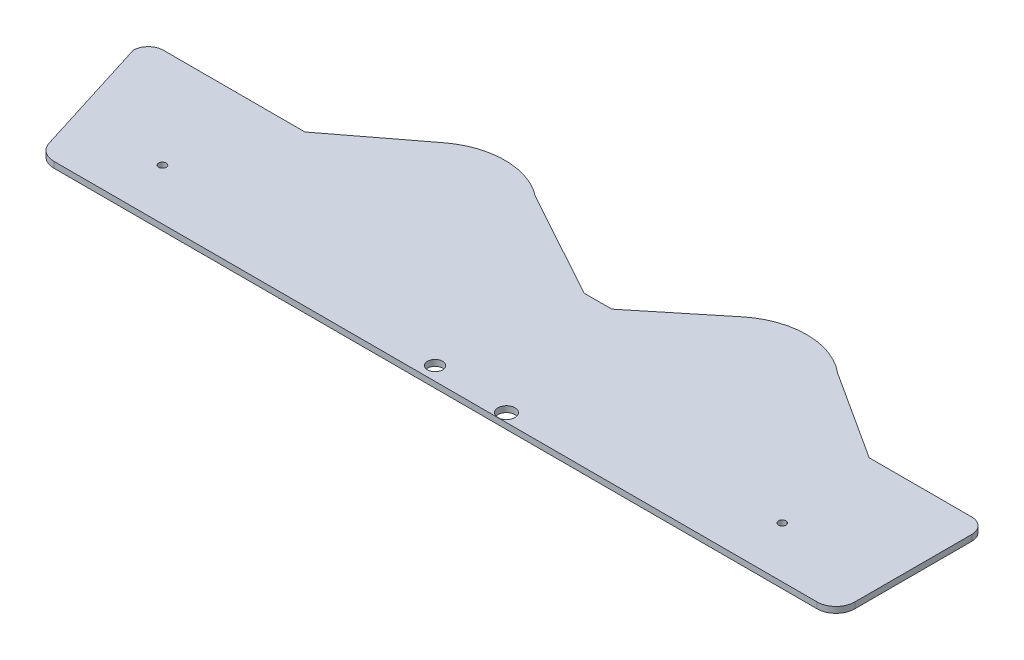
ISO-10303-21;
HEADER;
FILE_DESCRIPTION(('STEP AP214'),'2;1');
FILE_NAME('part.step','',(''),(''),'','','');
FILE_SCHEMA(('AUTOMOTIVE_DESIGN { 1 0 10303 214 1 1 1 1 }'));
ENDSEC;
DATA;
#1=APPLICATION_CONTEXT('core data for automotive mechanical design processes');
#2=APPLICATION_PROTOCOL_DEFINITION('international standard','automotive_design',2000,#1);
#3=PRODUCT_CONTEXT('',#1,'mechanical');
#4=PRODUCT('Part','Part','',(#3));
#5=PRODUCT_RELATED_PRODUCT_CATEGORY('part','',(#4));
#6=PRODUCT_DEFINITION_FORMATION('','',#4);
#7=PRODUCT_DEFINITION_CONTEXT('part definition',#1,'design');
#8=PRODUCT_DEFINITION('design','',#6,#7);
#9=PRODUCT_DEFINITION_SHAPE('','',#8);
#10=(LENGTH_UNIT() NAMED_UNIT(*) SI_UNIT(.MILLI.,.METRE.));
#11=(NAMED_UNIT(*) PLANE_ANGLE_UNIT() SI_UNIT($,.RADIAN.));
#12=(NAMED_UNIT(*) SI_UNIT($,.STERADIAN.) SOLID_ANGLE_UNIT());
#13=UNCERTAINTY_MEASURE_WITH_UNIT(LENGTH_MEASURE(1.E-05),#10,'distance_accuracy_value','');
#14=(GEOMETRIC_REPRESENTATION_CONTEXT(3) GLOBAL_UNCERTAINTY_ASSIGNED_CONTEXT((#13)) GLOBAL_UNIT_ASSIGNED_CONTEXT((#10,
#11,#12)) REPRESENTATION_CONTEXT('',''));
#15=CARTESIAN_POINT('',(0.,0.,0.));
#16=DIRECTION('',(0.,0.,1.));
#17=DIRECTION('',(1.,0.,0.));
#18=AXIS2_PLACEMENT_3D('',#15,#16,#17);
#19=CARTESIAN_POINT('',(0.,3.175,-150.));
#20=DIRECTION('',(0.,0.,-1.));
#21=DIRECTION('',(-1.,0.,0.));
#22=AXIS2_PLACEMENT_3D('',#19,#20,#21);
#23=PLANE('',#22);
#24=DIRECTION('',(1.,0.,0.));
#25=VECTOR('',#24,1.);
#26=CARTESIAN_POINT('',(0.,0.,-150.));
#27=LINE('',#26,#25);
#28=CARTESIAN_POINT('',(382.106475607173,0.,-150.));
#29=VERTEX_POINT('',#28);
#30=CARTESIAN_POINT('',(436.5,0.,-150.));
#31=VERTEX_POINT('',#30);
#32=EDGE_CURVE('E59',#29,#31,#27,.T.);
#33=ORIENTED_EDGE('',*,*,#32,.F.);
#34=DIRECTION('',(0.,-1.,0.));
#35=VECTOR('',#34,1.);
#36=CARTESIAN_POINT('',(382.106475607173,3.175,-150.));
#37=LINE('',#36,#35);
#38=CARTESIAN_POINT('',(382.106475607173,3.175,-150.));
#39=VERTEX_POINT('',#38);
#40=EDGE_CURVE('E54',#39,#29,#37,.T.);
#41=ORIENTED_EDGE('',*,*,#40,.F.);
#42=DIRECTION('',(1.,0.,0.));
#43=VECTOR('',#42,1.);
#44=CARTESIAN_POINT('',(0.,3.175,-150.));
#45=LINE('',#44,#43);
#46=CARTESIAN_POINT('',(436.5,3.175,-150.));
#47=VERTEX_POINT('',#46);
#48=EDGE_CURVE('E236',#39,#47,#45,.T.);
#49=ORIENTED_EDGE('',*,*,#48,.T.);
#50=DIRECTION('',(0.,-1.,0.));
#51=VECTOR('',#50,1.);
#52=CARTESIAN_POINT('',(436.5,3.175,-150.));
#53=LINE('',#52,#51);
#54=EDGE_CURVE('E265',#47,#31,#53,.T.);
#55=ORIENTED_EDGE('',*,*,#54,.T.);
#56=EDGE_LOOP('',(#33,#41,#49,#55));
#57=FACE_BOUND('',#56,.T.);
#58=ADVANCED_FACE('F39',(#57),#23,.T.);
#59=CARTESIAN_POINT('',(309.,3.175,-150.));
#60=DIRECTION('',(0.,-1.,0.));
#61=DIRECTION('',(0.,0.,-1.));
#62=AXIS2_PLACEMENT_3D('',#59,#60,#61);
#63=CYLINDRICAL_SURFACE('',#62,40.);
#64=DIRECTION('',(0.,-1.,0.));
#65=VECTOR('',#64,1.);
#66=CARTESIAN_POINT('',(283.734164599155,3.175,-181.010281544955));
#67=LINE('',#66,#65);
#68=CARTESIAN_POINT('',(283.734164599155,3.175,-181.010281544955));
#69=VERTEX_POINT('',#68);
#70=CARTESIAN_POINT('',(283.734164599155,0.,-181.010281544955));
#71=VERTEX_POINT('',#70);
#72=EDGE_CURVE('E180',#69,#71,#67,.T.);
#73=ORIENTED_EDGE('',*,*,#72,.F.);
#74=CARTESIAN_POINT('',(309.,3.175,-150.));
#75=DIRECTION('',(0.,1.,0.));
#76=DIRECTION('',(0.,0.,1.));
#77=AXIS2_PLACEMENT_3D('',#74,#75,#76);
#78=CIRCLE('',#77,40.);
#79=CARTESIAN_POINT('',(334.871034878903,3.175,-180.507204957101));
#80=VERTEX_POINT('',#79);
#81=EDGE_CURVE('E163',#80,#69,#78,.T.);
#82=ORIENTED_EDGE('',*,*,#81,.F.);
#83=DIRECTION('',(0.,-1.,0.));
#84=VECTOR('',#83,1.);
#85=CARTESIAN_POINT('',(334.871034878903,3.175,-180.507204957101));
#86=LINE('',#85,#84);
#87=CARTESIAN_POINT('',(334.871034878903,0.,-180.507204957101));
#88=VERTEX_POINT('',#87);
#89=EDGE_CURVE('E11',#88,#80,#86,.F.);
#90=ORIENTED_EDGE('',*,*,#89,.F.);
#91=CARTESIAN_POINT('',(309.,0.,-150.));
#92=DIRECTION('',(0.,1.,0.));
#93=DIRECTION('',(0.,0.,1.));
#94=AXIS2_PLACEMENT_3D('',#91,#92,#93);
#95=CIRCLE('',#94,40.);
#96=EDGE_CURVE('E150',#88,#71,#95,.T.);
#97=ORIENTED_EDGE('',*,*,#96,.T.);
#98=EDGE_LOOP('',(#73,#82,#90,#97));
#99=FACE_BOUND('',#98,.T.);
#100=ADVANCED_FACE('F162',(#99),#63,.T.);
#101=CARTESIAN_POINT('',(231.01461959859,3.175,-150.));
#102=VERTEX_POINT('',#101);
#103=CARTESIAN_POINT('',(245.673378314399,3.175,-150.));
#104=VERTEX_POINT('',#103);
#105=EDGE_CURVE('E240',#102,#104,#45,.T.);
#106=ORIENTED_EDGE('',*,*,#105,.T.);
#107=DIRECTION('',(0.,-1.,0.));
#108=VECTOR('',#107,1.);
#109=CARTESIAN_POINT('',(245.673378314399,3.175,-150.));
#110=LINE('',#109,#108);
#111=CARTESIAN_POINT('',(245.673378314399,0.,-150.));
#112=VERTEX_POINT('',#111);
#113=EDGE_CURVE('E175',#104,#112,#110,.T.);
#114=ORIENTED_EDGE('',*,*,#113,.T.);
#115=CARTESIAN_POINT('',(231.01461959859,0.,-150.));
#116=VERTEX_POINT('',#115);
#117=EDGE_CURVE('E257',#116,#112,#27,.T.);
#118=ORIENTED_EDGE('',*,*,#117,.F.);
#119=DIRECTION('',(0.,1.,0.));
#120=VECTOR('',#119,1.);
#121=CARTESIAN_POINT('',(231.01461959859,3.175,-150.));
#122=LINE('',#121,#120);
#123=EDGE_CURVE('E200',#116,#102,#122,.T.);
#124=ORIENTED_EDGE('',*,*,#123,.T.);
#125=EDGE_LOOP('',(#106,#114,#118,#124));
#126=FACE_BOUND('',#125,.T.);
#127=ADVANCED_FACE('F314',(#126),#23,.T.);
#128=CARTESIAN_POINT('',(8.,3.175,-150.));
#129=VERTEX_POINT('',#128);
#130=CARTESIAN_POINT('',(83.029725003325,3.175,-150.));
#131=VERTEX_POINT('',#130);
#132=EDGE_CURVE('E237',#129,#131,#45,.T.);
#133=ORIENTED_EDGE('',*,*,#132,.T.);
#134=DIRECTION('',(0.,-1.,0.));
#135=VECTOR('',#134,1.);
#136=CARTESIAN_POINT('',(83.0297250033249,3.175,-150.));
#137=LINE('',#136,#135);
#138=CARTESIAN_POINT('',(83.029725003325,0.,-150.));
#139=VERTEX_POINT('',#138);
#140=EDGE_CURVE('E202',#131,#139,#137,.T.);
#141=ORIENTED_EDGE('',*,*,#140,.T.);
#142=CARTESIAN_POINT('',(8.,0.,-150.));
#143=VERTEX_POINT('',#142);
#144=EDGE_CURVE('E253',#143,#139,#27,.T.);
#145=ORIENTED_EDGE('',*,*,#144,.F.);
#146=DIRECTION('',(0.,-1.,0.));
#147=VECTOR('',#146,1.);
#148=CARTESIAN_POINT('',(8.,3.175,-150.));
#149=LINE('',#148,#147);
#150=EDGE_CURVE('E263',#129,#143,#149,.T.);
#151=ORIENTED_EDGE('',*,*,#150,.F.);
#152=EDGE_LOOP('',(#133,#141,#145,#151));
#153=FACE_BOUND('',#152,.T.);
#154=ADVANCED_FACE('F315',(#153),#23,.T.);
#155=CARTESIAN_POINT('',(149.,3.175,-150.040398610273));
#156=DIRECTION('',(0.,-1.,0.));
#157=DIRECTION('',(0.,0.,-1.));
#158=AXIS2_PLACEMENT_3D('',#155,#156,#157);
#159=CYLINDRICAL_SURFACE('',#158,40.);
#160=DIRECTION('',(0.,-1.,0.));
#161=VECTOR('',#160,1.);
#162=CARTESIAN_POINT('',(124.164543782823,3.175,-181.39642059146));
#163=LINE('',#162,#161);
#164=CARTESIAN_POINT('',(124.164543782823,3.175,-181.39642059146));
#165=VERTEX_POINT('',#164);
#166=CARTESIAN_POINT('',(124.164543782823,0.,-181.39642059146));
#167=VERTEX_POINT('',#166);
#168=EDGE_CURVE('E197',#165,#167,#163,.T.);
#169=ORIENTED_EDGE('',*,*,#168,.F.);
#170=CARTESIAN_POINT('',(149.,3.175,-150.040398610273));
#171=DIRECTION('',(0.,1.,0.));
#172=DIRECTION('',(0.,0.,1.));
#173=AXIS2_PLACEMENT_3D('',#170,#171,#172);
#174=CIRCLE('',#173,40.);
#175=CARTESIAN_POINT('',(173.835456217177,3.175,-181.39642059146));
#176=VERTEX_POINT('',#175);
#177=EDGE_CURVE('E205',#176,#165,#174,.T.);
#178=ORIENTED_EDGE('',*,*,#177,.F.);
#179=DIRECTION('',(0.,-1.,0.));
#180=VECTOR('',#179,1.);
#181=CARTESIAN_POINT('',(173.835456217177,3.175,-181.39642059146));
#182=LINE('',#181,#180);
#183=CARTESIAN_POINT('',(173.835456217177,0.,-181.39642059146));
#184=VERTEX_POINT('',#183);
#185=EDGE_CURVE('E190',#176,#184,#182,.T.);
#186=ORIENTED_EDGE('',*,*,#185,.T.);
#187=CARTESIAN_POINT('',(149.,0.,-150.040398610273));
#188=DIRECTION('',(0.,1.,0.));
#189=DIRECTION('',(0.,0.,1.));
#190=AXIS2_PLACEMENT_3D('',#187,#188,#189);
#191=CIRCLE('',#190,40.);
#192=EDGE_CURVE('E204',#184,#167,#191,.T.);
#193=ORIENTED_EDGE('',*,*,#192,.T.);
#194=EDGE_LOOP('',(#169,#178,#186,#193));
#195=FACE_BOUND('',#194,.T.);
#196=ADVANCED_FACE('F325',(#195),#159,.T.);
#197=CARTESIAN_POINT('',(444.5,3.175,0.));
#198=DIRECTION('',(-1.,0.,0.));
#199=DIRECTION('',(0.,0.,1.));
#200=AXIS2_PLACEMENT_3D('',#197,#198,#199);
#201=PLANE('',#200);
#202=DIRECTION('',(0.,0.,-1.));
#203=VECTOR('',#202,1.);
#204=CARTESIAN_POINT('',(444.5,3.175,0.));
#205=LINE('',#204,#203);
#206=CARTESIAN_POINT('',(444.5,3.175,-80.));
#207=VERTEX_POINT('',#206);
#208=CARTESIAN_POINT('',(444.5,3.175,-142.));
#209=VERTEX_POINT('',#208);
#210=EDGE_CURVE('E230',#207,#209,#205,.T.);
#211=ORIENTED_EDGE('',*,*,#210,.F.);
#212=DIRECTION('',(0.,1.,0.));
#213=VECTOR('',#212,1.);
#214=CARTESIAN_POINT('',(444.5,0.,-80.));
#215=LINE('',#214,#213);
#216=CARTESIAN_POINT('',(444.5,0.,-80.));
#217=VERTEX_POINT('',#216);
#218=EDGE_CURVE('E287',#207,#217,#215,.F.);
#219=ORIENTED_EDGE('',*,*,#218,.T.);
#220=DIRECTION('',(0.,0.,-1.));
#221=VECTOR('',#220,1.);
#222=CARTESIAN_POINT('',(444.5,0.,0.));
#223=LINE('',#222,#221);
#224=CARTESIAN_POINT('',(444.5,0.,-142.));
#225=VERTEX_POINT('',#224);
#226=EDGE_CURVE('E248',#217,#225,#223,.T.);
#227=ORIENTED_EDGE('',*,*,#226,.T.);
#228=DIRECTION('',(0.,-1.,0.));
#229=VECTOR('',#228,1.);
#230=CARTESIAN_POINT('',(444.5,3.175,-142.));
#231=LINE('',#230,#229);
#232=EDGE_CURVE('E267',#209,#225,#231,.T.);
#233=ORIENTED_EDGE('',*,*,#232,.F.);
#234=EDGE_LOOP('',(#211,#219,#227,#233));
#235=FACE_BOUND('',#234,.T.);
#236=ADVANCED_FACE('F330',(#235),#201,.F.);
#237=CARTESIAN_POINT('',(40.5261663286004,3.175,-12.7022312373225));
#238=DIRECTION('',(0.954226213925607,0.,-0.29908582824534));
#239=DIRECTION('',(-0.29908582824534,0.,-0.954226213925608));
#240=AXIS2_PLACEMENT_3D('',#237,#238,#239);
#241=PLANE('',#240);
#242=DIRECTION('',(0.29908582824534,0.,0.954226213925608));
#243=VECTOR('',#242,1.);
#244=CARTESIAN_POINT('',(40.5261663286004,0.,-12.7022312373225));
#245=LINE('',#244,#243);
#246=CARTESIAN_POINT('',(0.,0.,-142.));
#247=VERTEX_POINT('',#246);
#248=CARTESIAN_POINT('',(20.3702690139033,0.,-77.0091417175466));
#249=VERTEX_POINT('',#248);
#250=EDGE_CURVE('E231',#247,#249,#245,.T.);
#251=ORIENTED_EDGE('',*,*,#250,.T.);
#252=DIRECTION('',(0.,-1.,0.));
#253=VECTOR('',#252,1.);
#254=CARTESIAN_POINT('',(20.3702690139033,3.175,-77.0091417175466));
#255=LINE('',#254,#253);
#256=CARTESIAN_POINT('',(20.3702690139033,3.175,-77.0091417175466));
#257=VERTEX_POINT('',#256);
#258=EDGE_CURVE('E278',#249,#257,#255,.F.);
#259=ORIENTED_EDGE('',*,*,#258,.T.);
#260=DIRECTION('',(0.29908582824534,0.,0.954226213925608));
#261=VECTOR('',#260,1.);
#262=CARTESIAN_POINT('',(40.5261663286004,3.175,-12.7022312373225));
#263=LINE('',#262,#261);
#264=CARTESIAN_POINT('',(0.,3.175,-142.));
#265=VERTEX_POINT('',#264);
#266=EDGE_CURVE('E242',#265,#257,#263,.T.);
#267=ORIENTED_EDGE('',*,*,#266,.F.);
#268=DIRECTION('',(0.,-1.,0.));
#269=VECTOR('',#268,1.);
#270=CARTESIAN_POINT('',(0.,3.175,-142.));
#271=LINE('',#270,#269);
#272=EDGE_CURVE('E245',#265,#247,#271,.T.);
#273=ORIENTED_EDGE('',*,*,#272,.T.);
#274=EDGE_LOOP('',(#251,#259,#267,#273));
#275=FACE_BOUND('',#274,.T.);
#276=ADVANCED_FACE('F352',(#275),#241,.F.);
#277=CARTESIAN_POINT('',(0.,3.175,0.));
#278=DIRECTION('',(0.,1.,0.));
#279=DIRECTION('',(0.,0.,1.));
#280=AXIS2_PLACEMENT_3D('',#277,#278,#279);
#281=PLANE('',#280);
#282=ORIENTED_EDGE('',*,*,#81,.T.);
#283=DIRECTION('',(-0.775257038623885,0.,0.631645885021129));
#284=VECTOR('',#283,1.);
#285=CARTESIAN_POINT('',(24.5647227929031,3.175,30.1497638133203));
#286=LINE('',#285,#284);
#287=EDGE_CURVE('E174',#69,#104,#286,.T.);
#288=ORIENTED_EDGE('',*,*,#287,.T.);
#289=ORIENTED_EDGE('',*,*,#105,.F.);
#290=DIRECTION('',(-0.876553077336371,0.,-0.48130520733952));
#291=VECTOR('',#290,1.);
#292=CARTESIAN_POINT('',(173.835456217177,3.175,-181.39642059146));
#293=LINE('',#292,#291);
#294=EDGE_CURVE('E186',#102,#176,#293,.T.);
#295=ORIENTED_EDGE('',*,*,#294,.T.);
#296=ORIENTED_EDGE('',*,*,#177,.T.);
#297=DIRECTION('',(-0.794913416528383,0.,0.606722885857435));
#298=VECTOR('',#297,1.);
#299=CARTESIAN_POINT('',(124.164543782823,3.175,-181.39642059146));
#300=LINE('',#299,#298);
#301=EDGE_CURVE('E183',#165,#131,#300,.T.);
#302=ORIENTED_EDGE('',*,*,#301,.T.);
#303=ORIENTED_EDGE('',*,*,#132,.F.);
#304=CARTESIAN_POINT('',(8.,3.175,-142.));
#305=DIRECTION('',(0.,1.,0.));
#306=DIRECTION('',(0.,0.,1.));
#307=AXIS2_PLACEMENT_3D('',#304,#305,#306);
#308=CIRCLE('',#307,8.);
#309=EDGE_CURVE('E239',#129,#265,#308,.T.);
#310=ORIENTED_EDGE('',*,*,#309,.T.);
#311=ORIENTED_EDGE('',*,*,#266,.T.);
#312=CARTESIAN_POINT('',(29.9125311531594,3.175,-80.));
#313=DIRECTION('',(0.,1.,0.));
#314=DIRECTION('',(0.,0.,1.));
#315=AXIS2_PLACEMENT_3D('',#312,#313,#314);
#316=CIRCLE('',#315,10.);
#317=CARTESIAN_POINT('',(29.9125311531594,3.175,-70.));
#318=VERTEX_POINT('',#317);
#319=EDGE_CURVE('E280',#257,#318,#316,.T.);
#320=ORIENTED_EDGE('',*,*,#319,.T.);
#321=DIRECTION('',(1.,0.,0.));
#322=VECTOR('',#321,1.);
#323=CARTESIAN_POINT('',(0.,3.175,-70.));
#324=LINE('',#323,#322);
#325=CARTESIAN_POINT('',(434.5,3.175,-70.));
#326=VERTEX_POINT('',#325);
#327=EDGE_CURVE('E223',#318,#326,#324,.T.);
#328=ORIENTED_EDGE('',*,*,#327,.T.);
#329=CARTESIAN_POINT('',(434.5,3.175,-80.));
#330=DIRECTION('',(0.,1.,0.));
#331=DIRECTION('',(0.,0.,1.));
#332=AXIS2_PLACEMENT_3D('',#329,#330,#331);
#333=CIRCLE('',#332,10.);
#334=EDGE_CURVE('E285',#326,#207,#333,.T.);
#335=ORIENTED_EDGE('',*,*,#334,.T.);
#336=ORIENTED_EDGE('',*,*,#210,.T.);
#337=CARTESIAN_POINT('',(436.5,3.175,-142.));
#338=DIRECTION('',(0.,1.,0.));
#339=DIRECTION('',(0.,0.,1.));
#340=AXIS2_PLACEMENT_3D('',#337,#338,#339);
#341=CIRCLE('',#340,7.99999999999999);
#342=EDGE_CURVE('E233',#209,#47,#341,.T.);
#343=ORIENTED_EDGE('',*,*,#342,.T.);
#344=ORIENTED_EDGE('',*,*,#48,.F.);
#345=DIRECTION('',(-0.840031412026268,0.,-0.542537765329893));
#346=VECTOR('',#345,1.);
#347=CARTESIAN_POINT('',(326.166341834622,3.175,-186.129166998658));
#348=LINE('',#347,#346);
#349=EDGE_CURVE('E168',#39,#80,#348,.T.);
#350=ORIENTED_EDGE('',*,*,#349,.T.);
#351=EDGE_LOOP('',(#282,#288,#289,#295,#296,#302,#303,#310,#311,#320,#328,#335,#336,#343,#344,#350));
#352=FACE_BOUND('',#351,.T.);
#353=CARTESIAN_POINT('',(265.281257273604,3.175,-74.5638669813257));
#354=DIRECTION('',(0.,1.,0.));
#355=DIRECTION('',(0.,0.,1.));
#356=AXIS2_PLACEMENT_3D('',#353,#354,#355);
#357=CIRCLE('',#356,4.51120579082737);
#358=CARTESIAN_POINT('',(265.281257273604,3.175,-70.0526611904984));
#359=VERTEX_POINT('',#358);
#360=EDGE_CURVE('E227',#359,#359,#357,.T.);
#361=ORIENTED_EDGE('',*,*,#360,.F.);
#362=EDGE_LOOP('',(#361));
#363=FACE_BOUND('',#362,.T.);
#364=CARTESIAN_POINT('',(224.75,3.175,-77.255));
#365=DIRECTION('',(0.,1.,0.));
#366=DIRECTION('',(0.,0.,1.));
#367=AXIS2_PLACEMENT_3D('',#364,#365,#366);
#368=CIRCLE('',#367,3.99083763901675);
#369=CARTESIAN_POINT('',(224.75,3.175,-73.2641623609833));
#370=VERTEX_POINT('',#369);
#371=EDGE_CURVE('E216',#370,#370,#368,.T.);
#372=ORIENTED_EDGE('',*,*,#371,.F.);
#373=EDGE_LOOP('',(#372));
#374=FACE_BOUND('',#373,.T.);
#375=CARTESIAN_POINT('',(60.5,3.175,-97.));
#376=DIRECTION('',(0.,1.,0.));
#377=DIRECTION('',(0.,0.,1.));
#378=AXIS2_PLACEMENT_3D('',#375,#376,#377);
#379=CIRCLE('',#378,2.);
#380=CARTESIAN_POINT('',(60.5,3.175,-95.));
#381=VERTEX_POINT('',#380);
#382=EDGE_CURVE('E217',#381,#381,#379,.T.);
#383=ORIENTED_EDGE('',*,*,#382,.F.);
#384=EDGE_LOOP('',(#383));
#385=FACE_BOUND('',#384,.T.);
#386=CARTESIAN_POINT('',(389.,3.175,-97.));
#387=DIRECTION('',(0.,1.,0.));
#388=DIRECTION('',(0.,0.,1.));
#389=AXIS2_PLACEMENT_3D('',#386,#387,#388);
#390=CIRCLE('',#389,2.);
#391=CARTESIAN_POINT('',(389.,3.175,-95.));
#392=VERTEX_POINT('',#391);
#393=EDGE_CURVE('E208',#392,#392,#390,.T.);
#394=ORIENTED_EDGE('',*,*,#393,.F.);
#395=EDGE_LOOP('',(#394));
#396=FACE_BOUND('',#395,.T.);
#397=ADVANCED_FACE('F339',(#352,#363,#374,#385,#396),#281,.T.);
#398=CARTESIAN_POINT('',(0.,0.,0.));
#399=DIRECTION('',(0.,1.,0.));
#400=DIRECTION('',(0.,0.,1.));
#401=AXIS2_PLACEMENT_3D('',#398,#399,#400);
#402=PLANE('',#401);
#403=DIRECTION('',(-0.775257038623885,0.,0.631645885021129));
#404=VECTOR('',#403,1.);
#405=CARTESIAN_POINT('',(24.5647227929031,0.,30.1497638133203));
#406=LINE('',#405,#404);
#407=EDGE_CURVE('E157',#71,#112,#406,.T.);
#408=ORIENTED_EDGE('',*,*,#407,.F.);
#409=ORIENTED_EDGE('',*,*,#96,.F.);
#410=DIRECTION('',(-0.840031412026268,0.,-0.542537765329893));
#411=VECTOR('',#410,1.);
#412=CARTESIAN_POINT('',(326.166341834622,0.,-186.129166998658));
#413=LINE('',#412,#411);
#414=EDGE_CURVE('E155',#29,#88,#413,.T.);
#415=ORIENTED_EDGE('',*,*,#414,.F.);
#416=ORIENTED_EDGE('',*,*,#32,.T.);
#417=CARTESIAN_POINT('',(436.5,0.,-142.));
#418=DIRECTION('',(0.,1.,0.));
#419=DIRECTION('',(0.,0.,1.));
#420=AXIS2_PLACEMENT_3D('',#417,#418,#419);
#421=CIRCLE('',#420,7.99999999999999);
#422=EDGE_CURVE('E250',#225,#31,#421,.T.);
#423=ORIENTED_EDGE('',*,*,#422,.F.);
#424=ORIENTED_EDGE('',*,*,#226,.F.);
#425=CARTESIAN_POINT('',(434.5,0.,-80.));
#426=DIRECTION('',(0.,1.,0.));
#427=DIRECTION('',(0.,0.,1.));
#428=AXIS2_PLACEMENT_3D('',#425,#426,#427);
#429=CIRCLE('',#428,10.);
#430=CARTESIAN_POINT('',(434.5,0.,-70.));
#431=VERTEX_POINT('',#430);
#432=EDGE_CURVE('E47',#217,#431,#429,.F.);
#433=ORIENTED_EDGE('',*,*,#432,.T.);
#434=DIRECTION('',(1.,0.,0.));
#435=VECTOR('',#434,1.);
#436=CARTESIAN_POINT('',(0.,0.,-70.));
#437=LINE('',#436,#435);
#438=CARTESIAN_POINT('',(29.9125311531594,0.,-70.));
#439=VERTEX_POINT('',#438);
#440=EDGE_CURVE('E270',#439,#431,#437,.T.);
#441=ORIENTED_EDGE('',*,*,#440,.F.);
#442=CARTESIAN_POINT('',(29.9125311531594,0.,-80.));
#443=DIRECTION('',(0.,1.,0.));
#444=DIRECTION('',(0.,0.,1.));
#445=AXIS2_PLACEMENT_3D('',#442,#443,#444);
#446=CIRCLE('',#445,10.);
#447=EDGE_CURVE('E276',#439,#249,#446,.F.);
#448=ORIENTED_EDGE('',*,*,#447,.T.);
#449=ORIENTED_EDGE('',*,*,#250,.F.);
#450=CARTESIAN_POINT('',(8.,0.,-142.));
#451=DIRECTION('',(0.,1.,0.));
#452=DIRECTION('',(0.,0.,1.));
#453=AXIS2_PLACEMENT_3D('',#450,#451,#452);
#454=CIRCLE('',#453,8.);
#455=EDGE_CURVE('E256',#143,#247,#454,.T.);
#456=ORIENTED_EDGE('',*,*,#455,.F.);
#457=ORIENTED_EDGE('',*,*,#144,.T.);
#458=DIRECTION('',(-0.794913416528383,0.,0.606722885857435));
#459=VECTOR('',#458,1.);
#460=CARTESIAN_POINT('',(124.164543782823,0.,-181.39642059146));
#461=LINE('',#460,#459);
#462=EDGE_CURVE('E182',#167,#139,#461,.T.);
#463=ORIENTED_EDGE('',*,*,#462,.F.);
#464=ORIENTED_EDGE('',*,*,#192,.F.);
#465=DIRECTION('',(-0.876553077336371,0.,-0.48130520733952));
#466=VECTOR('',#465,1.);
#467=CARTESIAN_POINT('',(173.835456217177,0.,-181.39642059146));
#468=LINE('',#467,#466);
#469=EDGE_CURVE('E187',#116,#184,#468,.T.);
#470=ORIENTED_EDGE('',*,*,#469,.F.);
#471=ORIENTED_EDGE('',*,*,#117,.T.);
#472=EDGE_LOOP('',(#408,#409,#415,#416,#423,#424,#433,#441,#448,#449,#456,#457,#463,#464,#470,#471));
#473=FACE_BOUND('',#472,.T.);
#474=CARTESIAN_POINT('',(265.281257273604,0.,-74.5638669813257));
#475=DIRECTION('',(0.,1.,0.));
#476=DIRECTION('',(0.,0.,1.));
#477=AXIS2_PLACEMENT_3D('',#474,#475,#476);
#478=CIRCLE('',#477,4.51120579082737);
#479=CARTESIAN_POINT('',(265.281257273604,0.,-70.0526611904984));
#480=VERTEX_POINT('',#479);
#481=EDGE_CURVE('E226',#480,#480,#478,.T.);
#482=ORIENTED_EDGE('',*,*,#481,.T.);
#483=EDGE_LOOP('',(#482));
#484=FACE_BOUND('',#483,.T.);
#485=CARTESIAN_POINT('',(224.75,0.,-77.255));
#486=DIRECTION('',(0.,1.,0.));
#487=DIRECTION('',(0.,0.,1.));
#488=AXIS2_PLACEMENT_3D('',#485,#486,#487);
#489=CIRCLE('',#488,3.99083763901675);
#490=CARTESIAN_POINT('',(224.75,0.,-73.2641623609833));
#491=VERTEX_POINT('',#490);
#492=EDGE_CURVE('E222',#491,#491,#489,.T.);
#493=ORIENTED_EDGE('',*,*,#492,.T.);
#494=EDGE_LOOP('',(#493));
#495=FACE_BOUND('',#494,.T.);
#496=CARTESIAN_POINT('',(60.5,0.,-97.));
#497=DIRECTION('',(0.,1.,0.));
#498=DIRECTION('',(0.,0.,1.));
#499=AXIS2_PLACEMENT_3D('',#496,#497,#498);
#500=CIRCLE('',#499,2.);
#501=CARTESIAN_POINT('',(60.5,0.,-95.));
#502=VERTEX_POINT('',#501);
#503=EDGE_CURVE('E213',#502,#502,#500,.T.);
#504=ORIENTED_EDGE('',*,*,#503,.T.);
#505=EDGE_LOOP('',(#504));
#506=FACE_BOUND('',#505,.T.);
#507=CARTESIAN_POINT('',(389.,0.,-97.));
#508=DIRECTION('',(0.,1.,0.));
#509=DIRECTION('',(0.,0.,1.));
#510=AXIS2_PLACEMENT_3D('',#507,#508,#509);
#511=CIRCLE('',#510,2.);
#512=CARTESIAN_POINT('',(389.,0.,-95.));
#513=VERTEX_POINT('',#512);
#514=EDGE_CURVE('E212',#513,#513,#511,.T.);
#515=ORIENTED_EDGE('',*,*,#514,.T.);
#516=EDGE_LOOP('',(#515));
#517=FACE_BOUND('',#516,.T.);
#518=ADVANCED_FACE('F152',(#473,#484,#495,#506,#517),#402,.F.);
#519=CARTESIAN_POINT('',(436.5,3.175,-142.));
#520=DIRECTION('',(0.,-1.,0.));
#521=DIRECTION('',(0.,0.,-1.));
#522=AXIS2_PLACEMENT_3D('',#519,#520,#521);
#523=CYLINDRICAL_SURFACE('',#522,7.99999999999999);
#524=ORIENTED_EDGE('',*,*,#422,.T.);
#525=ORIENTED_EDGE('',*,*,#54,.F.);
#526=ORIENTED_EDGE('',*,*,#342,.F.);
#527=ORIENTED_EDGE('',*,*,#232,.T.);
#528=EDGE_LOOP('',(#524,#525,#526,#527));
#529=FACE_BOUND('',#528,.T.);
#530=ADVANCED_FACE('F374',(#529),#523,.T.);
#531=CARTESIAN_POINT('',(8.,3.175,-142.));
#532=DIRECTION('',(0.,-1.,0.));
#533=DIRECTION('',(0.,0.,-1.));
#534=AXIS2_PLACEMENT_3D('',#531,#532,#533);
#535=CYLINDRICAL_SURFACE('',#534,8.);
#536=ORIENTED_EDGE('',*,*,#455,.T.);
#537=ORIENTED_EDGE('',*,*,#272,.F.);
#538=ORIENTED_EDGE('',*,*,#309,.F.);
#539=ORIENTED_EDGE('',*,*,#150,.T.);
#540=EDGE_LOOP('',(#536,#537,#538,#539));
#541=FACE_BOUND('',#540,.T.);
#542=ADVANCED_FACE('F349',(#541),#535,.T.);
#543=CARTESIAN_POINT('',(265.281257273604,3.175,-74.5638669813257));
#544=DIRECTION('',(0.,-1.,0.));
#545=DIRECTION('',(0.,0.,-1.));
#546=AXIS2_PLACEMENT_3D('',#543,#544,#545);
#547=CYLINDRICAL_SURFACE('',#546,4.51120579082737);
#548=ORIENTED_EDGE('',*,*,#360,.T.);
#549=EDGE_LOOP('',(#548));
#550=FACE_BOUND('',#549,.T.);
#551=ORIENTED_EDGE('',*,*,#481,.F.);
#552=EDGE_LOOP('',(#551));
#553=FACE_BOUND('',#552,.T.);
#554=ADVANCED_FACE('F441',(#550,#553),#547,.F.);
#555=CARTESIAN_POINT('',(0.,0.,-70.));
#556=DIRECTION('',(0.,0.,1.));
#557=DIRECTION('',(1.,0.,0.));
#558=AXIS2_PLACEMENT_3D('',#555,#556,#557);
#559=PLANE('',#558);
#560=ORIENTED_EDGE('',*,*,#440,.T.);
#561=DIRECTION('',(0.,1.,0.));
#562=VECTOR('',#561,1.);
#563=CARTESIAN_POINT('',(434.5,3.175,-70.));
#564=LINE('',#563,#562);
#565=EDGE_CURVE('E282',#431,#326,#564,.T.);
#566=ORIENTED_EDGE('',*,*,#565,.T.);
#567=ORIENTED_EDGE('',*,*,#327,.F.);
#568=DIRECTION('',(0.,-1.,0.));
#569=VECTOR('',#568,1.);
#570=CARTESIAN_POINT('',(29.9125311531594,0.,-70.));
#571=LINE('',#570,#569);
#572=EDGE_CURVE('E273',#318,#439,#571,.T.);
#573=ORIENTED_EDGE('',*,*,#572,.T.);
#574=EDGE_LOOP('',(#560,#566,#567,#573));
#575=FACE_BOUND('',#574,.T.);
#576=ADVANCED_FACE('F361',(#575),#559,.T.);
#577=CARTESIAN_POINT('',(29.9125311531594,0.,-80.));
#578=DIRECTION('',(0.,1.,0.));
#579=DIRECTION('',(0.,0.,1.));
#580=AXIS2_PLACEMENT_3D('',#577,#578,#579);
#581=CYLINDRICAL_SURFACE('',#580,10.);
#582=ORIENTED_EDGE('',*,*,#319,.F.);
#583=ORIENTED_EDGE('',*,*,#258,.F.);
#584=ORIENTED_EDGE('',*,*,#447,.F.);
#585=ORIENTED_EDGE('',*,*,#572,.F.);
#586=EDGE_LOOP('',(#582,#583,#584,#585));
#587=FACE_BOUND('',#586,.T.);
#588=ADVANCED_FACE('F358',(#587),#581,.T.);
#589=CARTESIAN_POINT('',(434.5,0.,-80.));
#590=DIRECTION('',(0.,-1.,0.));
#591=DIRECTION('',(0.,0.,-1.));
#592=AXIS2_PLACEMENT_3D('',#589,#590,#591);
#593=CYLINDRICAL_SURFACE('',#592,10.);
#594=ORIENTED_EDGE('',*,*,#432,.F.);
#595=ORIENTED_EDGE('',*,*,#218,.F.);
#596=ORIENTED_EDGE('',*,*,#334,.F.);
#597=ORIENTED_EDGE('',*,*,#565,.F.);
#598=EDGE_LOOP('',(#594,#595,#596,#597));
#599=FACE_BOUND('',#598,.T.);
#600=ADVANCED_FACE('F41',(#599),#593,.T.);
#601=CARTESIAN_POINT('',(224.75,-6.825,-77.255));
#602=DIRECTION('',(0.,1.,0.));
#603=DIRECTION('',(0.,0.,1.));
#604=AXIS2_PLACEMENT_3D('',#601,#602,#603);
#605=CYLINDRICAL_SURFACE('',#604,3.99083763901675);
#606=ORIENTED_EDGE('',*,*,#371,.T.);
#607=EDGE_LOOP('',(#606));
#608=FACE_BOUND('',#607,.T.);
#609=ORIENTED_EDGE('',*,*,#492,.F.);
#610=EDGE_LOOP('',(#609));
#611=FACE_BOUND('',#610,.T.);
#612=ADVANCED_FACE('F308',(#608,#611),#605,.F.);
#613=CARTESIAN_POINT('',(60.5,0.,-97.));
#614=DIRECTION('',(0.,1.,0.));
#615=DIRECTION('',(0.,0.,1.));
#616=AXIS2_PLACEMENT_3D('',#613,#614,#615);
#617=CYLINDRICAL_SURFACE('',#616,2.);
#618=ORIENTED_EDGE('',*,*,#503,.F.);
#619=EDGE_LOOP('',(#618));
#620=FACE_BOUND('',#619,.T.);
#621=ORIENTED_EDGE('',*,*,#382,.T.);
#622=EDGE_LOOP('',(#621));
#623=FACE_BOUND('',#622,.T.);
#624=ADVANCED_FACE('F298',(#620,#623),#617,.F.);
#625=CARTESIAN_POINT('',(389.,-6.825,-97.));
#626=DIRECTION('',(0.,1.,0.));
#627=DIRECTION('',(0.,0.,1.));
#628=AXIS2_PLACEMENT_3D('',#625,#626,#627);
#629=CYLINDRICAL_SURFACE('',#628,2.);
#630=ORIENTED_EDGE('',*,*,#393,.T.);
#631=EDGE_LOOP('',(#630));
#632=FACE_BOUND('',#631,.T.);
#633=ORIENTED_EDGE('',*,*,#514,.F.);
#634=EDGE_LOOP('',(#633));
#635=FACE_BOUND('',#634,.T.);
#636=ADVANCED_FACE('F295',(#632,#635),#629,.F.);
#637=CARTESIAN_POINT('',(124.164543782823,3.175,-181.39642059146));
#638=DIRECTION('',(0.606722885857435,0.,0.794913416528383));
#639=DIRECTION('',(0.794913416528383,0.,-0.606722885857435));
#640=AXIS2_PLACEMENT_3D('',#637,#638,#639);
#641=PLANE('',#640);
#642=ORIENTED_EDGE('',*,*,#140,.F.);
#643=ORIENTED_EDGE('',*,*,#301,.F.);
#644=ORIENTED_EDGE('',*,*,#168,.T.);
#645=ORIENTED_EDGE('',*,*,#462,.T.);
#646=EDGE_LOOP('',(#642,#643,#644,#645));
#647=FACE_BOUND('',#646,.T.);
#648=ADVANCED_FACE('F297',(#647),#641,.F.);
#649=CARTESIAN_POINT('',(173.835456217177,3.175,-181.39642059146));
#650=DIRECTION('',(-0.48130520733952,0.,0.876553077336371));
#651=DIRECTION('',(0.876553077336371,0.,0.48130520733952));
#652=AXIS2_PLACEMENT_3D('',#649,#650,#651);
#653=PLANE('',#652);
#654=ORIENTED_EDGE('',*,*,#123,.F.);
#655=ORIENTED_EDGE('',*,*,#469,.T.);
#656=ORIENTED_EDGE('',*,*,#185,.F.);
#657=ORIENTED_EDGE('',*,*,#294,.F.);
#658=EDGE_LOOP('',(#654,#655,#656,#657));
#659=FACE_BOUND('',#658,.T.);
#660=ADVANCED_FACE('F305',(#659),#653,.F.);
#661=CARTESIAN_POINT('',(24.5647227929031,3.175,30.1497638133203));
#662=DIRECTION('',(0.631645885021129,0.,0.775257038623884));
#663=DIRECTION('',(0.775257038623885,0.,-0.631645885021129));
#664=AXIS2_PLACEMENT_3D('',#661,#662,#663);
#665=PLANE('',#664);
#666=ORIENTED_EDGE('',*,*,#407,.T.);
#667=ORIENTED_EDGE('',*,*,#113,.F.);
#668=ORIENTED_EDGE('',*,*,#287,.F.);
#669=ORIENTED_EDGE('',*,*,#72,.T.);
#670=EDGE_LOOP('',(#666,#667,#668,#669));
#671=FACE_BOUND('',#670,.T.);
#672=ADVANCED_FACE('F381',(#671),#665,.F.);
#673=CARTESIAN_POINT('',(326.166341834622,3.175,-186.129166998658));
#674=DIRECTION('',(-0.542537765329893,0.,0.840031412026268));
#675=DIRECTION('',(0.840031412026268,0.,0.542537765329893));
#676=AXIS2_PLACEMENT_3D('',#673,#674,#675);
#677=PLANE('',#676);
#678=ORIENTED_EDGE('',*,*,#414,.T.);
#679=ORIENTED_EDGE('',*,*,#89,.T.);
#680=ORIENTED_EDGE('',*,*,#349,.F.);
#681=ORIENTED_EDGE('',*,*,#40,.T.);
#682=EDGE_LOOP('',(#678,#679,#680,#681));
#683=FACE_BOUND('',#682,.T.);
#684=ADVANCED_FACE('F167',(#683),#677,.F.);
#685=CLOSED_SHELL('',(#58,#100,#127,#154,#196,#236,#276,#397,#518,#530,#542,#554,#576,#588,#600,
#612,#624,#636,#648,#660,#672,#684));
#686=MANIFOLD_SOLID_BREP('B2',#685);
#687=ADVANCED_BREP_SHAPE_REPRESENTATION('',(#18,#686),#14);
#688=SHAPE_DEFINITION_REPRESENTATION(#9,#687);
ENDSEC;
END-ISO-10303-21;
